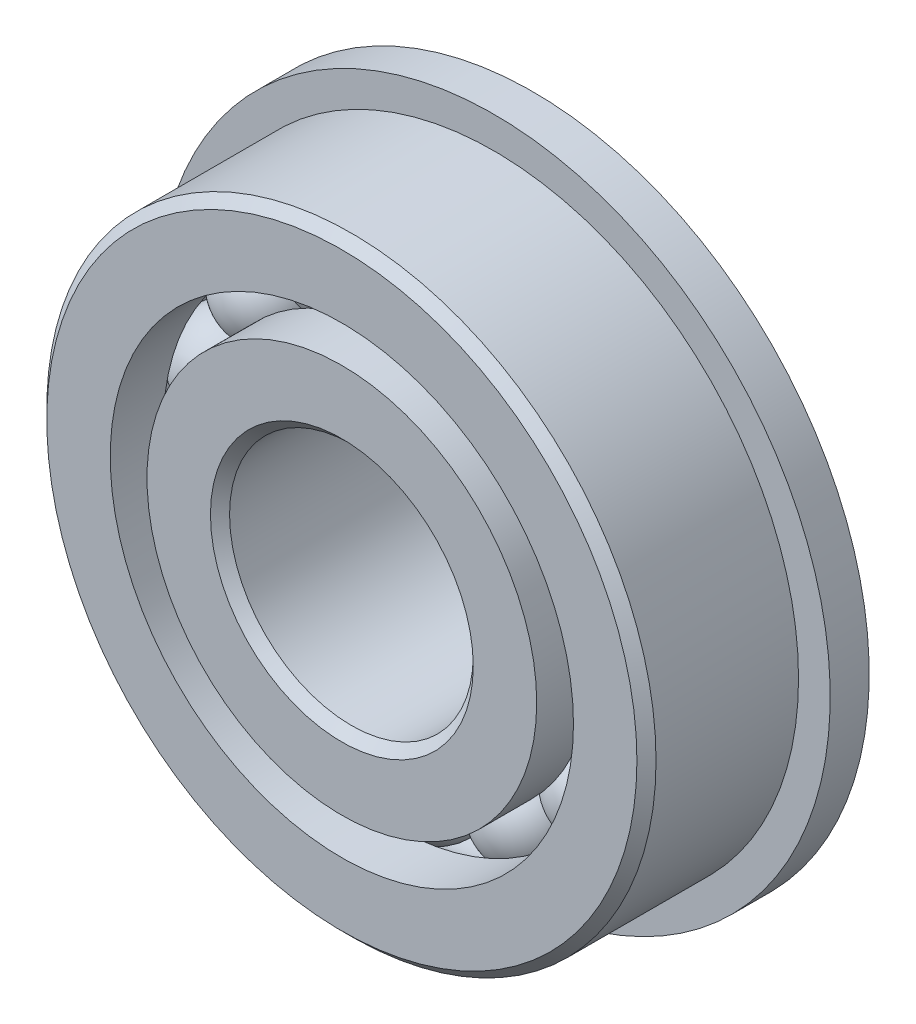
ISO-10303-21;
HEADER;
FILE_DESCRIPTION(('STEP AP214'),'2;1');
FILE_NAME('part.step','',(''),(''),'','','');
FILE_SCHEMA(('AUTOMOTIVE_DESIGN { 1 0 10303 214 1 1 1 1 }'));
ENDSEC;
DATA;
#1=APPLICATION_CONTEXT('core data for automotive mechanical design processes');
#2=APPLICATION_PROTOCOL_DEFINITION('international standard','automotive_design',2000,#1);
#3=PRODUCT_CONTEXT('',#1,'mechanical');
#4=PRODUCT('Part','Part','',(#3));
#5=PRODUCT_RELATED_PRODUCT_CATEGORY('part','',(#4));
#6=PRODUCT_DEFINITION_FORMATION('','',#4);
#7=PRODUCT_DEFINITION_CONTEXT('part definition',#1,'design');
#8=PRODUCT_DEFINITION('design','',#6,#7);
#9=PRODUCT_DEFINITION_SHAPE('','',#8);
#10=(LENGTH_UNIT() NAMED_UNIT(*) SI_UNIT(.MILLI.,.METRE.));
#11=(NAMED_UNIT(*) PLANE_ANGLE_UNIT() SI_UNIT($,.RADIAN.));
#12=(NAMED_UNIT(*) SI_UNIT($,.STERADIAN.) SOLID_ANGLE_UNIT());
#13=UNCERTAINTY_MEASURE_WITH_UNIT(LENGTH_MEASURE(1.E-05),#10,'distance_accuracy_value','');
#14=(GEOMETRIC_REPRESENTATION_CONTEXT(3) GLOBAL_UNCERTAINTY_ASSIGNED_CONTEXT((#13)) GLOBAL_UNIT_ASSIGNED_CONTEXT((#10,
#11,#12)) REPRESENTATION_CONTEXT('',''));
#15=CARTESIAN_POINT('',(0.,0.,0.));
#16=DIRECTION('',(0.,0.,1.));
#17=DIRECTION('',(1.,0.,0.));
#18=AXIS2_PLACEMENT_3D('',#15,#16,#17);
#19=CARTESIAN_POINT('',(-2.41076652547187,5.00600827228285,0.));
#20=DIRECTION('',(0.,0.,1.));
#21=DIRECTION('',(-0.433883739117546,0.900968867902425,0.));
#22=AXIS2_PLACEMENT_3D('',#19,#20,#21);
#23=SPHERICAL_SURFACE('',#22,1.20554465033679);
#24=CARTESIAN_POINT('',(-2.41076652547187,5.00600827228285,1.20554465033679));
#25=VERTEX_POINT('',#24);
#26=VERTEX_LOOP('',#25);
#27=FACE_BOUND('',#26,.T.);
#28=ADVANCED_FACE('F39',(#27),#23,.T.);
#29=CLOSED_SHELL('',(#28));
#30=MANIFOLD_SOLID_BREP('B2',#29);
#31=CARTESIAN_POINT('',(-4.34405117446295,3.46426521157764,0.));
#32=DIRECTION('',(0.,0.,1.));
#33=DIRECTION('',(-0.781831482468022,0.623489801858743,0.));
#34=AXIS2_PLACEMENT_3D('',#31,#32,#33);
#35=SPHERICAL_SURFACE('',#34,1.20554465033679);
#36=CARTESIAN_POINT('',(-4.34405117446295,3.46426521157764,1.20554465033679));
#37=VERTEX_POINT('',#36);
#38=VERTEX_LOOP('',#37);
#39=FACE_BOUND('',#38,.T.);
#40=ADVANCED_FACE('F59',(#39),#35,.T.);
#41=CLOSED_SHELL('',(#40));
#42=MANIFOLD_SOLID_BREP('B6',#41);
#43=CARTESIAN_POINT('',(-5.41694321206024,1.23638193929483,0.));
#44=DIRECTION('',(0.,0.,1.));
#45=DIRECTION('',(-0.974927912181821,0.222520933956325,0.));
#46=AXIS2_PLACEMENT_3D('',#43,#44,#45);
#47=SPHERICAL_SURFACE('',#46,1.20554465033679);
#48=CARTESIAN_POINT('',(-5.41694321206024,1.23638193929483,1.20554465033679));
#49=VERTEX_POINT('',#48);
#50=VERTEX_LOOP('',#49);
#51=FACE_BOUND('',#50,.T.);
#52=ADVANCED_FACE('F79',(#51),#47,.T.);
#53=CLOSED_SHELL('',(#52));
#54=MANIFOLD_SOLID_BREP('B35',#53);
#55=CARTESIAN_POINT('',(-5.41694321206027,-1.23638193929472,0.));
#56=DIRECTION('',(0.,0.,1.));
#57=DIRECTION('',(-0.974927912181826,-0.222520933956305,0.));
#58=AXIS2_PLACEMENT_3D('',#55,#56,#57);
#59=SPHERICAL_SURFACE('',#58,1.20554465033679);
#60=CARTESIAN_POINT('',(-5.41694321206027,-1.23638193929472,1.20554465033679));
#61=VERTEX_POINT('',#60);
#62=VERTEX_LOOP('',#61);
#63=FACE_BOUND('',#62,.T.);
#64=ADVANCED_FACE('F99',(#63),#59,.T.);
#65=CLOSED_SHELL('',(#64));
#66=MANIFOLD_SOLID_BREP('B55',#65);
#67=CARTESIAN_POINT('',(-4.34405117446302,-3.46426521157755,0.));
#68=DIRECTION('',(0.,0.,1.));
#69=DIRECTION('',(-0.781831482468035,-0.623489801858727,0.));
#70=AXIS2_PLACEMENT_3D('',#67,#68,#69);
#71=SPHERICAL_SURFACE('',#70,1.20554465033679);
#72=CARTESIAN_POINT('',(-4.34405117446302,-3.46426521157755,1.20554465033679));
#73=VERTEX_POINT('',#72);
#74=VERTEX_LOOP('',#73);
#75=FACE_BOUND('',#74,.T.);
#76=ADVANCED_FACE('F119',(#75),#71,.T.);
#77=CLOSED_SHELL('',(#76));
#78=MANIFOLD_SOLID_BREP('B75',#77);
#79=CARTESIAN_POINT('',(-2.41076652547197,-5.0060082722828,0.));
#80=DIRECTION('',(0.,0.,1.));
#81=DIRECTION('',(-0.433883739117565,-0.900968867902416,0.));
#82=AXIS2_PLACEMENT_3D('',#79,#80,#81);
#83=SPHERICAL_SURFACE('',#82,1.20554465033679);
#84=CARTESIAN_POINT('',(-2.41076652547197,-5.0060082722828,1.20554465033679));
#85=VERTEX_POINT('',#84);
#86=VERTEX_LOOP('',#85);
#87=FACE_BOUND('',#86,.T.);
#88=ADVANCED_FACE('F139',(#87),#83,.T.);
#89=CLOSED_SHELL('',(#88));
#90=MANIFOLD_SOLID_BREP('B95',#89);
#91=CARTESIAN_POINT('',(0.,-5.55625,0.));
#92=DIRECTION('',(0.,0.,1.));
#93=DIRECTION('',(0.,-1.,0.));
#94=AXIS2_PLACEMENT_3D('',#91,#92,#93);
#95=SPHERICAL_SURFACE('',#94,1.20554465033679);
#96=CARTESIAN_POINT('',(0.,-5.55625,1.20554465033679));
#97=VERTEX_POINT('',#96);
#98=VERTEX_LOOP('',#97);
#99=FACE_BOUND('',#98,.T.);
#100=ADVANCED_FACE('F159',(#99),#95,.T.);
#101=CLOSED_SHELL('',(#100));
#102=MANIFOLD_SOLID_BREP('B115',#101);
#103=CARTESIAN_POINT('',(2.4107665254719,-5.00600827228283,0.));
#104=DIRECTION('',(0.,0.,1.));
#105=DIRECTION('',(0.433883739117553,-0.900968867902422,0.));
#106=AXIS2_PLACEMENT_3D('',#103,#104,#105);
#107=SPHERICAL_SURFACE('',#106,1.20554465033679);
#108=CARTESIAN_POINT('',(2.4107665254719,-5.00600827228283,1.20554465033679));
#109=VERTEX_POINT('',#108);
#110=VERTEX_LOOP('',#109);
#111=FACE_BOUND('',#110,.T.);
#112=ADVANCED_FACE('F179',(#111),#107,.T.);
#113=CLOSED_SHELL('',(#112));
#114=MANIFOLD_SOLID_BREP('B135',#113);
#115=CARTESIAN_POINT('',(4.34405117446297,-3.46426521157761,0.));
#116=DIRECTION('',(0.,0.,1.));
#117=DIRECTION('',(0.781831482468027,-0.623489801858737,0.));
#118=AXIS2_PLACEMENT_3D('',#115,#116,#117);
#119=SPHERICAL_SURFACE('',#118,1.20554465033679);
#120=CARTESIAN_POINT('',(4.34405117446297,-3.46426521157761,1.20554465033679));
#121=VERTEX_POINT('',#120);
#122=VERTEX_LOOP('',#121);
#123=FACE_BOUND('',#122,.T.);
#124=ADVANCED_FACE('F199',(#123),#119,.T.);
#125=CLOSED_SHELL('',(#124));
#126=MANIFOLD_SOLID_BREP('B155',#125);
#127=CARTESIAN_POINT('',(5.41694321206025,-1.23638193929479,0.));
#128=DIRECTION('',(0.,0.,1.));
#129=DIRECTION('',(0.974927912181823,-0.222520933956318,0.));
#130=AXIS2_PLACEMENT_3D('',#127,#128,#129);
#131=SPHERICAL_SURFACE('',#130,1.20554465033679);
#132=CARTESIAN_POINT('',(5.41694321206025,-1.23638193929479,1.20554465033679));
#133=VERTEX_POINT('',#132);
#134=VERTEX_LOOP('',#133);
#135=FACE_BOUND('',#134,.T.);
#136=ADVANCED_FACE('F219',(#135),#131,.T.);
#137=CLOSED_SHELL('',(#136));
#138=MANIFOLD_SOLID_BREP('B175',#137);
#139=CARTESIAN_POINT('',(5.41694321206026,1.23638193929476,0.));
#140=DIRECTION('',(0.,0.,1.));
#141=DIRECTION('',(0.974927912181824,0.222520933956311,0.));
#142=AXIS2_PLACEMENT_3D('',#139,#140,#141);
#143=SPHERICAL_SURFACE('',#142,1.20554465033679);
#144=CARTESIAN_POINT('',(5.41694321206026,1.23638193929476,1.20554465033679));
#145=VERTEX_POINT('',#144);
#146=VERTEX_LOOP('',#145);
#147=FACE_BOUND('',#146,.T.);
#148=ADVANCED_FACE('F239',(#147),#143,.T.);
#149=CLOSED_SHELL('',(#148));
#150=MANIFOLD_SOLID_BREP('B195',#149);
#151=CARTESIAN_POINT('',(4.344051174463,3.46426521157758,0.));
#152=DIRECTION('',(0.,0.,1.));
#153=DIRECTION('',(0.781831482468031,0.623489801858732,0.));
#154=AXIS2_PLACEMENT_3D('',#151,#152,#153);
#155=SPHERICAL_SURFACE('',#154,1.20554465033679);
#156=CARTESIAN_POINT('',(4.344051174463,3.46426521157758,1.20554465033679));
#157=VERTEX_POINT('',#156);
#158=VERTEX_LOOP('',#157);
#159=FACE_BOUND('',#158,.T.);
#160=ADVANCED_FACE('F259',(#159),#155,.T.);
#161=CLOSED_SHELL('',(#160));
#162=MANIFOLD_SOLID_BREP('B215',#161);
#163=CARTESIAN_POINT('',(2.41076652547194,5.00600827228281,0.));
#164=DIRECTION('',(0.,0.,1.));
#165=DIRECTION('',(0.433883739117559,0.900968867902419,0.));
#166=AXIS2_PLACEMENT_3D('',#163,#164,#165);
#167=SPHERICAL_SURFACE('',#166,1.20554465033679);
#168=CARTESIAN_POINT('',(2.41076652547194,5.00600827228281,1.20554465033679));
#169=VERTEX_POINT('',#168);
#170=VERTEX_LOOP('',#169);
#171=FACE_BOUND('',#170,.T.);
#172=ADVANCED_FACE('F279',(#171),#167,.T.);
#173=CLOSED_SHELL('',(#172));
#174=MANIFOLD_SOLID_BREP('B235',#173);
#175=CARTESIAN_POINT('',(0.,5.55625,0.));
#176=DIRECTION('',(0.,0.,1.));
#177=DIRECTION('',(0.,1.,0.));
#178=AXIS2_PLACEMENT_3D('',#175,#176,#177);
#179=SPHERICAL_SURFACE('',#178,1.20554465033679);
#180=CARTESIAN_POINT('',(0.,5.55625,1.20554465033679));
#181=VERTEX_POINT('',#180);
#182=VERTEX_LOOP('',#181);
#183=FACE_BOUND('',#182,.T.);
#184=ADVANCED_FACE('F301',(#183),#179,.T.);
#185=CLOSED_SHELL('',(#184));
#186=MANIFOLD_SOLID_BREP('B255',#185);
#187=CARTESIAN_POINT('',(0.,5.07727857142857,2.4892));
#188=DIRECTION('',(0.,0.,-1.));
#189=DIRECTION('',(-1.,0.,0.));
#190=AXIS2_PLACEMENT_3D('',#187,#188,#189);
#191=PLANE('',#190);
#192=CARTESIAN_POINT('',(0.,0.,2.4892));
#193=DIRECTION('',(0.,0.,1.));
#194=DIRECTION('',(1.,0.,0.));
#195=AXIS2_PLACEMENT_3D('',#192,#193,#194);
#196=CIRCLE('',#195,3.42392);
#197=CARTESIAN_POINT('',(3.42392,0.,2.4892));
#198=VERTEX_POINT('',#197);
#199=EDGE_CURVE('E348',#198,#198,#196,.T.);
#200=ORIENTED_EDGE('',*,*,#199,.F.);
#201=EDGE_LOOP('',(#200));
#202=FACE_BOUND('',#201,.T.);
#203=CARTESIAN_POINT('',(0.,0.,2.4892));
#204=DIRECTION('',(0.,0.,1.));
#205=DIRECTION('',(1.,0.,0.));
#206=AXIS2_PLACEMENT_3D('',#203,#204,#205);
#207=CIRCLE('',#206,5.07727857142857);
#208=CARTESIAN_POINT('',(5.07727857142857,0.,2.4892));
#209=VERTEX_POINT('',#208);
#210=EDGE_CURVE('E300',#209,#209,#207,.T.);
#211=ORIENTED_EDGE('',*,*,#210,.T.);
#212=EDGE_LOOP('',(#211));
#213=FACE_BOUND('',#212,.T.);
#214=ADVANCED_FACE('F320',(#202,#213),#191,.F.);
#215=CARTESIAN_POINT('',(0.,0.,2.4892));
#216=DIRECTION('',(0.,0.,1.));
#217=DIRECTION('',(1.,0.,0.));
#218=AXIS2_PLACEMENT_3D('',#215,#216,#217);
#219=CYLINDRICAL_SURFACE('',#218,5.07727857142857);
#220=ORIENTED_EDGE('',*,*,#210,.F.);
#221=EDGE_LOOP('',(#220));
#222=FACE_BOUND('',#221,.T.);
#223=CARTESIAN_POINT('',(0.,0.,1.10631111111111));
#224=DIRECTION('',(0.,0.,1.));
#225=DIRECTION('',(1.,0.,0.));
#226=AXIS2_PLACEMENT_3D('',#223,#224,#225);
#227=CIRCLE('',#226,5.07727857142857);
#228=CARTESIAN_POINT('',(5.07727857142857,0.,1.10631111111111));
#229=VERTEX_POINT('',#228);
#230=EDGE_CURVE('E326',#229,#229,#227,.T.);
#231=ORIENTED_EDGE('',*,*,#230,.T.);
#232=EDGE_LOOP('',(#231));
#233=FACE_BOUND('',#232,.T.);
#234=ADVANCED_FACE('F355',(#222,#233),#219,.T.);
#235=CARTESIAN_POINT('',(0.,0.,0.));
#236=DIRECTION('',(0.,0.,1.));
#237=DIRECTION('',(1.,0.,0.));
#238=AXIS2_PLACEMENT_3D('',#235,#236,#237);
#239=TOROIDAL_SURFACE('',#238,5.55625,1.20554465033679);
#240=ORIENTED_EDGE('',*,*,#230,.F.);
#241=EDGE_LOOP('',(#240));
#242=FACE_BOUND('',#241,.T.);
#243=CARTESIAN_POINT('',(0.,0.,-1.10631111111111));
#244=DIRECTION('',(0.,0.,1.));
#245=DIRECTION('',(1.,0.,0.));
#246=AXIS2_PLACEMENT_3D('',#243,#244,#245);
#247=CIRCLE('',#246,5.07727857142857);
#248=CARTESIAN_POINT('',(5.07727857142857,0.,-1.10631111111111));
#249=VERTEX_POINT('',#248);
#250=EDGE_CURVE('E330',#249,#249,#247,.T.);
#251=ORIENTED_EDGE('',*,*,#250,.T.);
#252=EDGE_LOOP('',(#251));
#253=FACE_BOUND('',#252,.T.);
#254=ADVANCED_FACE('F359',(#242,#253),#239,.F.);
#255=CARTESIAN_POINT('',(0.,0.,2.4892));
#256=DIRECTION('',(0.,0.,1.));
#257=DIRECTION('',(1.,0.,0.));
#258=AXIS2_PLACEMENT_3D('',#255,#256,#257);
#259=CYLINDRICAL_SURFACE('',#258,5.07727857142857);
#260=ORIENTED_EDGE('',*,*,#250,.F.);
#261=EDGE_LOOP('',(#260));
#262=FACE_BOUND('',#261,.T.);
#263=CARTESIAN_POINT('',(0.,0.,-2.4892));
#264=DIRECTION('',(0.,0.,1.));
#265=DIRECTION('',(1.,0.,0.));
#266=AXIS2_PLACEMENT_3D('',#263,#264,#265);
#267=CIRCLE('',#266,5.07727857142857);
#268=CARTESIAN_POINT('',(5.07727857142857,0.,-2.4892));
#269=VERTEX_POINT('',#268);
#270=EDGE_CURVE('E334',#269,#269,#267,.T.);
#271=ORIENTED_EDGE('',*,*,#270,.T.);
#272=EDGE_LOOP('',(#271));
#273=FACE_BOUND('',#272,.T.);
#274=ADVANCED_FACE('F364',(#262,#273),#259,.T.);
#275=CARTESIAN_POINT('',(0.,3.42392,-2.4892));
#276=DIRECTION('',(0.,0.,1.));
#277=DIRECTION('',(1.,0.,0.));
#278=AXIS2_PLACEMENT_3D('',#275,#276,#277);
#279=PLANE('',#278);
#280=ORIENTED_EDGE('',*,*,#270,.F.);
#281=EDGE_LOOP('',(#280));
#282=FACE_BOUND('',#281,.T.);
#283=CARTESIAN_POINT('',(0.,0.,-2.4892));
#284=DIRECTION('',(0.,0.,1.));
#285=DIRECTION('',(1.,0.,0.));
#286=AXIS2_PLACEMENT_3D('',#283,#284,#285);
#287=CIRCLE('',#286,3.42392);
#288=CARTESIAN_POINT('',(3.42392,0.,-2.4892));
#289=VERTEX_POINT('',#288);
#290=EDGE_CURVE('E339',#289,#289,#287,.T.);
#291=ORIENTED_EDGE('',*,*,#290,.T.);
#292=EDGE_LOOP('',(#291));
#293=FACE_BOUND('',#292,.T.);
#294=ADVANCED_FACE('F370',(#282,#293),#279,.F.);
#295=CARTESIAN_POINT('',(0.,0.,-2.24028));
#296=DIRECTION('',(0.,0.,-1.));
#297=DIRECTION('',(-1.,0.,0.));
#298=AXIS2_PLACEMENT_3D('',#295,#296,#297);
#299=CONICAL_SURFACE('',#298,3.175,0.785398163397449);
#300=ORIENTED_EDGE('',*,*,#290,.F.);
#301=EDGE_LOOP('',(#300));
#302=FACE_BOUND('',#301,.T.);
#303=CARTESIAN_POINT('',(0.,0.,-2.24028));
#304=DIRECTION('',(0.,0.,1.));
#305=DIRECTION('',(1.,0.,0.));
#306=AXIS2_PLACEMENT_3D('',#303,#304,#305);
#307=CIRCLE('',#306,3.175);
#308=CARTESIAN_POINT('',(3.175,0.,-2.24028));
#309=VERTEX_POINT('',#308);
#310=EDGE_CURVE('E342',#309,#309,#307,.T.);
#311=ORIENTED_EDGE('',*,*,#310,.T.);
#312=EDGE_LOOP('',(#311));
#313=FACE_BOUND('',#312,.T.);
#314=ADVANCED_FACE('F374',(#302,#313),#299,.F.);
#315=CARTESIAN_POINT('',(0.,0.,2.4892));
#316=DIRECTION('',(0.,0.,1.));
#317=DIRECTION('',(1.,0.,0.));
#318=AXIS2_PLACEMENT_3D('',#315,#316,#317);
#319=CYLINDRICAL_SURFACE('',#318,3.175);
#320=ORIENTED_EDGE('',*,*,#310,.F.);
#321=EDGE_LOOP('',(#320));
#322=FACE_BOUND('',#321,.T.);
#323=CARTESIAN_POINT('',(0.,0.,2.24028));
#324=DIRECTION('',(0.,0.,1.));
#325=DIRECTION('',(1.,0.,0.));
#326=AXIS2_PLACEMENT_3D('',#323,#324,#325);
#327=CIRCLE('',#326,3.175);
#328=CARTESIAN_POINT('',(3.175,0.,2.24028));
#329=VERTEX_POINT('',#328);
#330=EDGE_CURVE('E345',#329,#329,#327,.T.);
#331=ORIENTED_EDGE('',*,*,#330,.T.);
#332=EDGE_LOOP('',(#331));
#333=FACE_BOUND('',#332,.T.);
#334=ADVANCED_FACE('F378',(#322,#333),#319,.F.);
#335=CARTESIAN_POINT('',(0.,0.,2.4892));
#336=DIRECTION('',(0.,0.,1.));
#337=DIRECTION('',(1.,0.,0.));
#338=AXIS2_PLACEMENT_3D('',#335,#336,#337);
#339=CONICAL_SURFACE('',#338,3.42392,0.785398163397448);
#340=ORIENTED_EDGE('',*,*,#330,.F.);
#341=EDGE_LOOP('',(#340));
#342=FACE_BOUND('',#341,.T.);
#343=ORIENTED_EDGE('',*,*,#199,.T.);
#344=EDGE_LOOP('',(#343));
#345=FACE_BOUND('',#344,.T.);
#346=ADVANCED_FACE('F352',(#342,#345),#339,.F.);
#347=CLOSED_SHELL('',(#214,#234,#254,#274,#294,#314,#334,#346));
#348=MANIFOLD_SOLID_BREP('B275',#347);
#349=CARTESIAN_POINT('',(0.,0.,2.24028));
#350=DIRECTION('',(0.,0.,-1.));
#351=DIRECTION('',(-1.,0.,0.));
#352=AXIS2_PLACEMENT_3D('',#349,#350,#351);
#353=CONICAL_SURFACE('',#352,7.9375,0.785398163397447);
#354=CARTESIAN_POINT('',(0.,0.,2.4892));
#355=DIRECTION('',(0.,0.,1.));
#356=DIRECTION('',(1.,0.,0.));
#357=AXIS2_PLACEMENT_3D('',#354,#355,#356);
#358=CIRCLE('',#357,7.68858);
#359=CARTESIAN_POINT('',(7.68858,0.,2.4892));
#360=VERTEX_POINT('',#359);
#361=EDGE_CURVE('E463',#360,#360,#358,.T.);
#362=ORIENTED_EDGE('',*,*,#361,.F.);
#363=EDGE_LOOP('',(#362));
#364=FACE_BOUND('',#363,.T.);
#365=CARTESIAN_POINT('',(0.,0.,2.24028));
#366=DIRECTION('',(0.,0.,1.));
#367=DIRECTION('',(1.,0.,0.));
#368=AXIS2_PLACEMENT_3D('',#365,#366,#367);
#369=CIRCLE('',#368,7.9375);
#370=CARTESIAN_POINT('',(7.9375,0.,2.24028));
#371=VERTEX_POINT('',#370);
#372=EDGE_CURVE('E319',#371,#371,#369,.T.);
#373=ORIENTED_EDGE('',*,*,#372,.T.);
#374=EDGE_LOOP('',(#373));
#375=FACE_BOUND('',#374,.T.);
#376=ADVANCED_FACE('F441',(#364,#375),#353,.T.);
#377=CARTESIAN_POINT('',(0.,0.,2.4892));
#378=DIRECTION('',(0.,0.,1.));
#379=DIRECTION('',(1.,0.,0.));
#380=AXIS2_PLACEMENT_3D('',#377,#378,#379);
#381=CYLINDRICAL_SURFACE('',#380,7.9375);
#382=CARTESIAN_POINT('',(0.,0.,-1.4732));
#383=DIRECTION('',(0.,0.,1.));
#384=DIRECTION('',(1.,0.,0.));
#385=AXIS2_PLACEMENT_3D('',#382,#383,#384);
#386=CIRCLE('',#385,7.9375);
#387=CARTESIAN_POINT('',(7.9375,0.,-1.4732));
#388=VERTEX_POINT('',#387);
#389=EDGE_CURVE('E466',#388,#388,#386,.T.);
#390=ORIENTED_EDGE('',*,*,#389,.T.);
#391=EDGE_LOOP('',(#390));
#392=FACE_BOUND('',#391,.T.);
#393=ORIENTED_EDGE('',*,*,#372,.F.);
#394=EDGE_LOOP('',(#393));
#395=FACE_BOUND('',#394,.T.);
#396=ADVANCED_FACE('F486',(#392,#395),#381,.T.);
#397=CARTESIAN_POINT('',(0.,7.68858,-2.4892));
#398=DIRECTION('',(0.,0.,1.));
#399=DIRECTION('',(1.,0.,0.));
#400=AXIS2_PLACEMENT_3D('',#397,#398,#399);
#401=PLANE('',#400);
#402=CARTESIAN_POINT('',(0.,0.,-2.4892));
#403=DIRECTION('',(0.,0.,1.));
#404=DIRECTION('',(1.,0.,0.));
#405=AXIS2_PLACEMENT_3D('',#402,#403,#404);
#406=CIRCLE('',#405,6.03522142857143);
#407=CARTESIAN_POINT('',(6.03522142857143,0.,-2.4892));
#408=VERTEX_POINT('',#407);
#409=EDGE_CURVE('E447',#408,#408,#406,.T.);
#410=ORIENTED_EDGE('',*,*,#409,.T.);
#411=EDGE_LOOP('',(#410));
#412=FACE_BOUND('',#411,.T.);
#413=CARTESIAN_POINT('',(0.,0.,-2.4892));
#414=DIRECTION('',(0.,0.,-1.));
#415=DIRECTION('',(-1.,0.,0.));
#416=AXIS2_PLACEMENT_3D('',#413,#414,#415);
#417=CIRCLE('',#416,8.763);
#418=CARTESIAN_POINT('',(-8.763,0.,-2.4892));
#419=VERTEX_POINT('',#418);
#420=EDGE_CURVE('E469',#419,#419,#417,.T.);
#421=ORIENTED_EDGE('',*,*,#420,.T.);
#422=EDGE_LOOP('',(#421));
#423=FACE_BOUND('',#422,.T.);
#424=ADVANCED_FACE('F489',(#412,#423),#401,.F.);
#425=CARTESIAN_POINT('',(0.,0.,2.4892));
#426=DIRECTION('',(0.,0.,1.));
#427=DIRECTION('',(1.,0.,0.));
#428=AXIS2_PLACEMENT_3D('',#425,#426,#427);
#429=CYLINDRICAL_SURFACE('',#428,6.03522142857143);
#430=CARTESIAN_POINT('',(0.,0.,-1.10631111111111));
#431=DIRECTION('',(0.,0.,1.));
#432=DIRECTION('',(1.,0.,0.));
#433=AXIS2_PLACEMENT_3D('',#430,#431,#432);
#434=CIRCLE('',#433,6.03522142857143);
#435=CARTESIAN_POINT('',(6.03522142857143,0.,-1.10631111111111));
#436=VERTEX_POINT('',#435);
#437=EDGE_CURVE('E451',#436,#436,#434,.T.);
#438=ORIENTED_EDGE('',*,*,#437,.T.);
#439=EDGE_LOOP('',(#438));
#440=FACE_BOUND('',#439,.T.);
#441=ORIENTED_EDGE('',*,*,#409,.F.);
#442=EDGE_LOOP('',(#441));
#443=FACE_BOUND('',#442,.T.);
#444=ADVANCED_FACE('F494',(#440,#443),#429,.F.);
#445=CARTESIAN_POINT('',(0.,0.,0.));
#446=DIRECTION('',(0.,0.,1.));
#447=DIRECTION('',(1.,0.,0.));
#448=AXIS2_PLACEMENT_3D('',#445,#446,#447);
#449=TOROIDAL_SURFACE('',#448,5.55625,1.20554465033679);
#450=ORIENTED_EDGE('',*,*,#437,.F.);
#451=EDGE_LOOP('',(#450));
#452=FACE_BOUND('',#451,.T.);
#453=CARTESIAN_POINT('',(0.,0.,1.10631111111111));
#454=DIRECTION('',(0.,0.,1.));
#455=DIRECTION('',(1.,0.,0.));
#456=AXIS2_PLACEMENT_3D('',#453,#454,#455);
#457=CIRCLE('',#456,6.03522142857143);
#458=CARTESIAN_POINT('',(6.03522142857143,0.,1.10631111111111));
#459=VERTEX_POINT('',#458);
#460=EDGE_CURVE('E455',#459,#459,#457,.T.);
#461=ORIENTED_EDGE('',*,*,#460,.T.);
#462=EDGE_LOOP('',(#461));
#463=FACE_BOUND('',#462,.T.);
#464=ADVANCED_FACE('F500',(#452,#463),#449,.F.);
#465=CARTESIAN_POINT('',(0.,0.,2.4892));
#466=DIRECTION('',(0.,0.,1.));
#467=DIRECTION('',(1.,0.,0.));
#468=AXIS2_PLACEMENT_3D('',#465,#466,#467);
#469=CYLINDRICAL_SURFACE('',#468,6.03522142857143);
#470=ORIENTED_EDGE('',*,*,#460,.F.);
#471=EDGE_LOOP('',(#470));
#472=FACE_BOUND('',#471,.T.);
#473=CARTESIAN_POINT('',(0.,0.,2.4892));
#474=DIRECTION('',(0.,0.,1.));
#475=DIRECTION('',(1.,0.,0.));
#476=AXIS2_PLACEMENT_3D('',#473,#474,#475);
#477=CIRCLE('',#476,6.03522142857143);
#478=CARTESIAN_POINT('',(6.03522142857143,0.,2.4892));
#479=VERTEX_POINT('',#478);
#480=EDGE_CURVE('E460',#479,#479,#477,.T.);
#481=ORIENTED_EDGE('',*,*,#480,.T.);
#482=EDGE_LOOP('',(#481));
#483=FACE_BOUND('',#482,.T.);
#484=ADVANCED_FACE('F504',(#472,#483),#469,.F.);
#485=CARTESIAN_POINT('',(0.,7.68858,2.4892));
#486=DIRECTION('',(0.,0.,-1.));
#487=DIRECTION('',(-1.,0.,0.));
#488=AXIS2_PLACEMENT_3D('',#485,#486,#487);
#489=PLANE('',#488);
#490=ORIENTED_EDGE('',*,*,#480,.F.);
#491=EDGE_LOOP('',(#490));
#492=FACE_BOUND('',#491,.T.);
#493=ORIENTED_EDGE('',*,*,#361,.T.);
#494=EDGE_LOOP('',(#493));
#495=FACE_BOUND('',#494,.T.);
#496=ADVANCED_FACE('F482',(#492,#495),#489,.F.);
#497=CARTESIAN_POINT('',(0.,6.03522142857143,-1.4732));
#498=DIRECTION('',(0.,0.,1.));
#499=DIRECTION('',(1.,0.,0.));
#500=AXIS2_PLACEMENT_3D('',#497,#498,#499);
#501=PLANE('',#500);
#502=CARTESIAN_POINT('',(0.,0.,-1.4732));
#503=DIRECTION('',(0.,0.,-1.));
#504=DIRECTION('',(-1.,0.,0.));
#505=AXIS2_PLACEMENT_3D('',#502,#503,#504);
#506=CIRCLE('',#505,8.763);
#507=CARTESIAN_POINT('',(-8.763,0.,-1.4732));
#508=VERTEX_POINT('',#507);
#509=EDGE_CURVE('E472',#508,#508,#506,.T.);
#510=ORIENTED_EDGE('',*,*,#509,.F.);
#511=EDGE_LOOP('',(#510));
#512=FACE_BOUND('',#511,.T.);
#513=ORIENTED_EDGE('',*,*,#389,.F.);
#514=EDGE_LOOP('',(#513));
#515=FACE_BOUND('',#514,.T.);
#516=ADVANCED_FACE('F479',(#512,#515),#501,.T.);
#517=CARTESIAN_POINT('',(0.,0.,-2.4892));
#518=DIRECTION('',(0.,0.,-1.));
#519=DIRECTION('',(-1.,0.,0.));
#520=AXIS2_PLACEMENT_3D('',#517,#518,#519);
#521=CYLINDRICAL_SURFACE('',#520,8.763);
#522=ORIENTED_EDGE('',*,*,#509,.T.);
#523=EDGE_LOOP('',(#522));
#524=FACE_BOUND('',#523,.T.);
#525=ORIENTED_EDGE('',*,*,#420,.F.);
#526=EDGE_LOOP('',(#525));
#527=FACE_BOUND('',#526,.T.);
#528=ADVANCED_FACE('F476',(#524,#527),#521,.T.);
#529=CLOSED_SHELL('',(#376,#396,#424,#444,#464,#484,#496,#516,#528));
#530=MANIFOLD_SOLID_BREP('B295',#529);
#531=ADVANCED_BREP_SHAPE_REPRESENTATION('',(#18,#30,#42,#54,#66,#78,#90,#102,#114,#126,#138,
#150,#162,#174,#186,#348,#530),#14);
#532=SHAPE_DEFINITION_REPRESENTATION(#9,#531);
ENDSEC;
END-ISO-10303-21;
